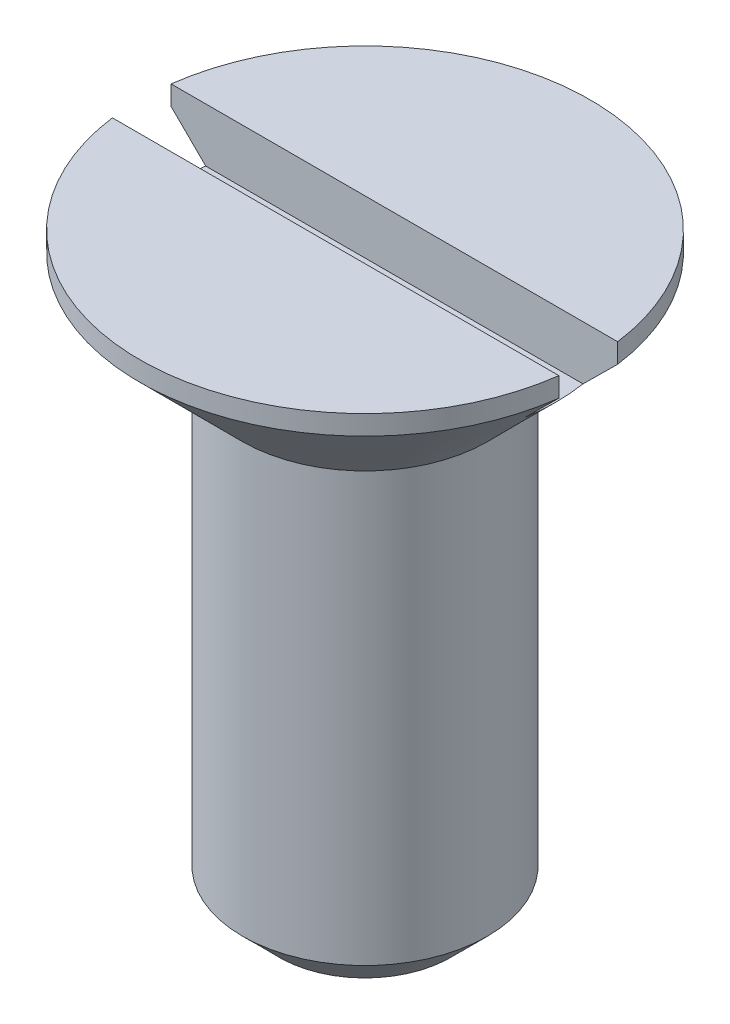
ISO-10303-21;
HEADER;
FILE_DESCRIPTION(('STEP AP214'),'2;1');
FILE_NAME('part.step','',(''),(''),'','','');
FILE_SCHEMA(('AUTOMOTIVE_DESIGN { 1 0 10303 214 1 1 1 1 }'));
ENDSEC;
DATA;
#1=APPLICATION_CONTEXT('core data for automotive mechanical design processes');
#2=APPLICATION_PROTOCOL_DEFINITION('international standard','automotive_design',2000,#1);
#3=PRODUCT_CONTEXT('',#1,'mechanical');
#4=PRODUCT('Part','Part','',(#3));
#5=PRODUCT_RELATED_PRODUCT_CATEGORY('part','',(#4));
#6=PRODUCT_DEFINITION_FORMATION('','',#4);
#7=PRODUCT_DEFINITION_CONTEXT('part definition',#1,'design');
#8=PRODUCT_DEFINITION('design','',#6,#7);
#9=PRODUCT_DEFINITION_SHAPE('','',#8);
#10=(LENGTH_UNIT() NAMED_UNIT(*) SI_UNIT(.MILLI.,.METRE.));
#11=(NAMED_UNIT(*) PLANE_ANGLE_UNIT() SI_UNIT($,.RADIAN.));
#12=(NAMED_UNIT(*) SI_UNIT($,.STERADIAN.) SOLID_ANGLE_UNIT());
#13=UNCERTAINTY_MEASURE_WITH_UNIT(LENGTH_MEASURE(1.E-05),#10,'distance_accuracy_value','');
#14=(GEOMETRIC_REPRESENTATION_CONTEXT(3) GLOBAL_UNCERTAINTY_ASSIGNED_CONTEXT((#13)) GLOBAL_UNIT_ASSIGNED_CONTEXT((#10,
#11,#12)) REPRESENTATION_CONTEXT('',''));
#15=CARTESIAN_POINT('',(0.,0.,0.));
#16=DIRECTION('',(0.,0.,1.));
#17=DIRECTION('',(1.,0.,0.));
#18=AXIS2_PLACEMENT_3D('',#15,#16,#17);
#19=CARTESIAN_POINT('',(0.,125.763182897862,0.));
#20=DIRECTION('',(0.,1.,0.));
#21=DIRECTION('',(-1.,0.,0.));
#22=AXIS2_PLACEMENT_3D('',#19,#20,#21);
#23=CYLINDRICAL_SURFACE('',#22,4.60000000000001);
#24=CARTESIAN_POINT('',(0.,91.6350422227854,0.));
#25=DIRECTION('',(0.,1.,0.));
#26=DIRECTION('',(-1.,0.,0.));
#27=AXIS2_PLACEMENT_3D('',#24,#25,#26);
#28=CIRCLE('',#27,4.60000000000001);
#29=CARTESIAN_POINT('',(4.56070170039656,91.6350422227854,-0.600000000000001));
#30=VERTEX_POINT('',#29);
#31=CARTESIAN_POINT('',(-4.56070170039657,91.6350422227854,-0.599999999999999));
#32=VERTEX_POINT('',#31);
#33=EDGE_CURVE('E103',#30,#32,#28,.T.);
#34=ORIENTED_EDGE('',*,*,#33,.T.);
#35=DIRECTION('',(0.,1.,0.));
#36=VECTOR('',#35,1.);
#37=CARTESIAN_POINT('',(-4.56070170039657,125.763182897862,-0.599999999999999));
#38=LINE('',#37,#36);
#39=CARTESIAN_POINT('',(-4.56070170039657,92.0350422227854,-0.599999999999999));
#40=VERTEX_POINT('',#39);
#41=EDGE_CURVE('E136',#32,#40,#38,.T.);
#42=ORIENTED_EDGE('',*,*,#41,.T.);
#43=CARTESIAN_POINT('',(0.,92.0350422227854,0.));
#44=DIRECTION('',(0.,1.,0.));
#45=DIRECTION('',(-1.,0.,0.));
#46=AXIS2_PLACEMENT_3D('',#43,#44,#45);
#47=CIRCLE('',#46,4.60000000000001);
#48=CARTESIAN_POINT('',(4.56070170039656,92.0350422227854,-0.600000000000001));
#49=VERTEX_POINT('',#48);
#50=EDGE_CURVE('E100',#49,#40,#47,.T.);
#51=ORIENTED_EDGE('',*,*,#50,.F.);
#52=DIRECTION('',(0.,1.,0.));
#53=VECTOR('',#52,1.);
#54=CARTESIAN_POINT('',(4.56070170039655,125.763182897862,-0.600000000000001));
#55=LINE('',#54,#53);
#56=EDGE_CURVE('E106',#49,#30,#55,.F.);
#57=ORIENTED_EDGE('',*,*,#56,.T.);
#58=EDGE_LOOP('',(#34,#42,#51,#57));
#59=FACE_BOUND('',#58,.T.);
#60=ADVANCED_FACE('F29',(#59),#23,.T.);
#61=CARTESIAN_POINT('',(0.,92.0350422227854,0.));
#62=DIRECTION('',(0.,-1.,0.));
#63=DIRECTION('',(1.,0.,0.));
#64=AXIS2_PLACEMENT_3D('',#61,#62,#63);
#65=PLANE('',#64);
#66=ORIENTED_EDGE('',*,*,#50,.T.);
#67=DIRECTION('',(1.,0.,0.));
#68=VECTOR('',#67,1.);
#69=CARTESIAN_POINT('',(0.,92.0350422227854,-0.6));
#70=LINE('',#69,#68);
#71=EDGE_CURVE('E88',#40,#49,#70,.T.);
#72=ORIENTED_EDGE('',*,*,#71,.T.);
#73=EDGE_LOOP('',(#66,#72));
#74=FACE_BOUND('',#73,.T.);
#75=ADVANCED_FACE('F162',(#74),#65,.F.);
#76=CARTESIAN_POINT('',(-4.56070170039657,91.6350422227854,0.600000000000001));
#77=VERTEX_POINT('',#76);
#78=CARTESIAN_POINT('',(4.56070170039656,91.6350422227854,0.599999999999999));
#79=VERTEX_POINT('',#78);
#80=EDGE_CURVE('E89',#77,#79,#28,.T.);
#81=ORIENTED_EDGE('',*,*,#80,.T.);
#82=DIRECTION('',(0.,1.,0.));
#83=VECTOR('',#82,1.);
#84=CARTESIAN_POINT('',(4.56070170039655,125.763182897862,0.599999999999999));
#85=LINE('',#84,#83);
#86=CARTESIAN_POINT('',(4.56070170039656,92.0350422227854,0.599999999999999));
#87=VERTEX_POINT('',#86);
#88=EDGE_CURVE('E83',#79,#87,#85,.T.);
#89=ORIENTED_EDGE('',*,*,#88,.T.);
#90=CARTESIAN_POINT('',(-4.56070170039657,92.0350422227854,0.600000000000001));
#91=VERTEX_POINT('',#90);
#92=EDGE_CURVE('E93',#91,#87,#47,.T.);
#93=ORIENTED_EDGE('',*,*,#92,.F.);
#94=DIRECTION('',(0.,1.,0.));
#95=VECTOR('',#94,1.);
#96=CARTESIAN_POINT('',(-4.56070170039657,125.763182897862,0.600000000000001));
#97=LINE('',#96,#95);
#98=EDGE_CURVE('E44',#91,#77,#97,.F.);
#99=ORIENTED_EDGE('',*,*,#98,.T.);
#100=EDGE_LOOP('',(#81,#89,#93,#99));
#101=FACE_BOUND('',#100,.T.);
#102=ADVANCED_FACE('F31',(#101),#23,.T.);
#103=CARTESIAN_POINT('',(0.,89.5350422227853,0.));
#104=DIRECTION('',(0.,1.,0.));
#105=DIRECTION('',(-1.,0.,0.));
#106=AXIS2_PLACEMENT_3D('',#103,#104,#105);
#107=CONICAL_SURFACE('',#106,2.50000000000001,0.785398163397447);
#108=ORIENTED_EDGE('',*,*,#33,.F.);
#109=CARTESIAN_POINT('',(10.1183814062174,97.1711974249163,-0.600000000000001));
#110=CARTESIAN_POINT('',(9.77237880412529,96.8258061906552,-0.600000000000001));
#111=CARTESIAN_POINT('',(9.42634955709616,96.4804416345571,-0.600000000000001));
#112=CARTESIAN_POINT('',(8.73419947980488,95.7897950444589,-0.600000000000001));
#113=CARTESIAN_POINT('',(8.388078648379,95.4445130116251,-0.600000000000001));
#114=CARTESIAN_POINT('',(7.69561256912969,94.7539663689884,-0.600000000000001));
#115=CARTESIAN_POINT('',(7.34926728513487,94.4087017954521,-0.600000000000001));
#116=CARTESIAN_POINT('',(6.65639767644153,93.7183613801069,-0.600000000000001));
#117=CARTESIAN_POINT('',(6.30987335413863,93.3732855358936,-0.600000000000001));
#118=CARTESIAN_POINT('',(5.60826287125325,92.6751948374246,-0.600000000000001));
#119=CARTESIAN_POINT('',(5.25316970822674,92.3221870172649,-0.600000000000001));
#120=CARTESIAN_POINT('',(4.7201088126015,91.7930850430478,-0.600000000000001));
#121=CARTESIAN_POINT('',(4.54234803292824,91.6167824265002,-0.600000000000001));
#122=CARTESIAN_POINT('',(4.18662953547047,91.2643774012031,-0.600000000000001));
#123=CARTESIAN_POINT('',(4.00867181849118,91.0882749916411,-0.6));
#124=CARTESIAN_POINT('',(3.65250227610172,90.7363944531224,-0.6));
#125=CARTESIAN_POINT('',(3.47429050503804,90.5606162691968,-0.6));
#126=CARTESIAN_POINT('',(3.11741605694824,90.2095126089977,-0.6));
#127=CARTESIAN_POINT('',(2.93875337293158,90.034187139829,-0.6));
#128=CARTESIAN_POINT('',(2.58070617190924,89.6842982894952,-0.6));
#129=CARTESIAN_POINT('',(2.40132170753326,89.5097348546333,-0.6));
#130=CARTESIAN_POINT('',(2.13120273030564,89.2489731972991,-0.6));
#131=CARTESIAN_POINT('',(2.04099050490045,89.1622343171125,-0.6));
#132=CARTESIAN_POINT('',(1.86005552948669,88.989291070384,-0.6));
#133=CARTESIAN_POINT('',(1.76933278423143,88.9030866988811,-0.6));
#134=CARTESIAN_POINT('',(1.62900147259109,88.7709497673453,-0.6));
#135=CARTESIAN_POINT('',(1.57966840408975,88.7247248039743,-0.6));
#136=CARTESIAN_POINT('',(1.48070610854209,88.6325913272551,-0.6));
#137=CARTESIAN_POINT('',(1.4310768773385,88.5866828183688,-0.6));
#138=CARTESIAN_POINT('',(1.33153228050089,88.4953792770954,-0.6));
#139=CARTESIAN_POINT('',(1.28161769843002,88.4499833927485,-0.6));
#140=CARTESIAN_POINT('',(1.18126809147799,88.3597737364228,-0.6));
#141=CARTESIAN_POINT('',(1.13083308164358,88.3149599476984,-0.6));
#142=CARTESIAN_POINT('',(1.01594428142606,88.2145154966473,-0.6));
#143=CARTESIAN_POINT('',(0.951277890986286,88.1591252346927,-0.6));
#144=CARTESIAN_POINT('',(0.852790765066545,88.0775958456865,-0.6));
#145=CARTESIAN_POINT('',(0.81965389261971,88.0506324331999,-0.6));
#146=CARTESIAN_POINT('',(0.752777223477808,87.9974660707094,-0.6));
#147=CARTESIAN_POINT('',(0.719037476243006,87.9712630587804,-0.6));
#148=CARTESIAN_POINT('',(0.65048142845816,87.9196953491401,-0.6));
#149=CARTESIAN_POINT('',(0.615658548989345,87.8943393357401,-0.6));
#150=CARTESIAN_POINT('',(0.544903946043137,87.8451477875962,-0.6));
#151=CARTESIAN_POINT('',(0.508971381999003,87.8213134495998,-0.6));
#152=CARTESIAN_POINT('',(0.43578405330071,87.7760439984933,-0.6));
#153=CARTESIAN_POINT('',(0.398534766710509,87.7546002032245,-0.6));
#154=CARTESIAN_POINT('',(0.322227819580053,87.715305202778,-0.6));
#155=CARTESIAN_POINT('',(0.283173497154299,87.6974476685799,-0.6));
#156=CARTESIAN_POINT('',(0.202020652551026,87.6670144522289,-0.6));
#157=CARTESIAN_POINT('',(0.159877310376875,87.6545497761668,-0.6));
#158=CARTESIAN_POINT('',(0.0955758352340131,87.6422428328775,-0.6));
#159=CARTESIAN_POINT('',(0.0740249717194329,87.6392051798506,-0.6));
#160=CARTESIAN_POINT('',(0.0307182768822359,87.6354419032215,-0.6));
#161=CARTESIAN_POINT('',(0.00896247682933661,87.6347159324499,-0.6));
#162=CARTESIAN_POINT('',(-0.0345699639383349,87.6356417056636,-0.6));
#163=CARTESIAN_POINT('',(-0.0563464310543447,87.6373014090222,-0.6));
#164=CARTESIAN_POINT('',(-0.0996152185496461,87.6428756091461,-0.6));
#165=CARTESIAN_POINT('',(-0.121107336978696,87.646791628788,-0.6));
#166=CARTESIAN_POINT('',(-0.185134942209239,87.6615779230767,-0.6));
#167=CARTESIAN_POINT('',(-0.226969791715522,87.6754759618972,-0.6));
#168=CARTESIAN_POINT('',(-0.315586324599734,87.7115427172652,-0.6));
#169=CARTESIAN_POINT('',(-0.361919520428995,87.7347444443576,-0.6));
#170=CARTESIAN_POINT('',(-0.452224755648142,87.7854541151573,-0.6));
#171=CARTESIAN_POINT('',(-0.496190701048888,87.8129725200949,-0.6));
#172=CARTESIAN_POINT('',(-0.582670192201253,87.8707850073226,-0.6));
#173=CARTESIAN_POINT('',(-0.625171506044438,87.9010970676717,-0.6));
#174=CARTESIAN_POINT('',(-0.708877631350628,87.963336031104,-0.6));
#175=CARTESIAN_POINT('',(-0.750084003850097,87.9952608585858,-0.6));
#176=CARTESIAN_POINT('',(-0.837865316854145,88.0651925186186,-0.6));
#177=CARTESIAN_POINT('',(-0.884294486800732,88.1033812639536,-0.6));
#178=CARTESIAN_POINT('',(-0.976334289151162,88.180735575695,-0.6));
#179=CARTESIAN_POINT('',(-1.02194484154761,88.2199012366957,-0.6));
#180=CARTESIAN_POINT('',(-1.15793123332394,88.3384233163224,-0.6));
#181=CARTESIAN_POINT('',(-1.2474322930666,88.4187805994875,-0.6));
#182=CARTESIAN_POINT('',(-1.4252515599586,88.5810203963855,-0.6));
#183=CARTESIAN_POINT('',(-1.51356798693599,88.6629048412524,-0.6));
#184=CARTESIAN_POINT('',(-1.68936713658788,88.8275294992386,-0.6));
#185=CARTESIAN_POINT('',(-1.77685001626741,88.9102695448215,-0.6));
#186=CARTESIAN_POINT('',(-1.95074219272013,89.075800548441,-0.6));
#187=CARTESIAN_POINT('',(-2.03715478318169,89.1585880553625,-0.6));
#188=CARTESIAN_POINT('',(-2.20961469118055,89.3245509976718,-0.6));
#189=CARTESIAN_POINT('',(-2.29566199027879,89.4077264522077,-0.6));
#190=CARTESIAN_POINT('',(-2.55328247225683,89.6575365067473,-0.6));
#191=CARTESIAN_POINT('',(-2.72446181119681,89.8245769488416,-0.6));
#192=CARTESIAN_POINT('',(-3.19700560903381,90.2872827869049,-0.6));
#193=CARTESIAN_POINT('',(-3.49776123544563,90.5835688070181,-0.6));
#194=CARTESIAN_POINT('',(-4.09847548130347,91.1769520537994,-0.6));
#195=CARTESIAN_POINT('',(-4.39843409280127,91.4740492884979,-0.599999999999999));
#196=CARTESIAN_POINT('',(-4.99800686759835,92.0687909715099,-0.599999999999999));
#197=CARTESIAN_POINT('',(-5.2976208825954,92.3664355693181,-0.599999999999999));
#198=CARTESIAN_POINT('',(-5.89658396088355,92.9619889882596,-0.599999999999999));
#199=CARTESIAN_POINT('',(-6.19593302510774,93.259897808455,-0.599999999999999));
#200=CARTESIAN_POINT('',(-6.79741034406435,93.858825334728,-0.599999999999999));
#201=CARTESIAN_POINT('',(-7.09953690219863,94.1598457445183,-0.599999999999999));
#202=CARTESIAN_POINT('',(-7.70367180435057,94.7620058689572,-0.599999999999999));
#203=CARTESIAN_POINT('',(-8.00568014822725,95.0631455837474,-0.599999999999999));
#204=CARTESIAN_POINT('',(-8.6095058889519,95.6654023879578,-0.599999999999999));
#205=CARTESIAN_POINT('',(-8.91132331553827,95.966519447564,-0.599999999999999));
#206=CARTESIAN_POINT('',(-9.51489468647575,96.5688164140502,-0.599999999999999));
#207=CARTESIAN_POINT('',(-9.81664863090741,96.8699963208495,-0.599999999999999));
#208=CARTESIAN_POINT('',(-10.1183814062174,97.1711974249163,-0.599999999999999));
#209=B_SPLINE_CURVE_WITH_KNOTS('',3,(#109,#110,#111,#112,#113,#114,#115,#116,#117,#118,#119,
#120,#121,#122,#123,#124,#125,#126,#127,#128,#129,#130,#131,#132,#133,#134,#135,#136,#137,#138,
#139,#140,#141,#142,#143,#144,#145,#146,#147,#148,#149,#150,#151,#152,#153,#154,#155,#156,#157,
#158,#159,#160,#161,#162,#163,#164,#165,#166,#167,#168,#169,#170,#171,#172,#173,#174,#175,#176,
#177,#178,#179,#180,#181,#182,#183,#184,#185,#186,#187,#188,#189,#190,#191,#192,#193,#194,#195,
#196,#197,#198,#199,#200,#201,#202,#203,#204,#205,#206,#207,#208),.UNSPECIFIED.,.F.,.F.,(4,2,2,
2,2,2,2,2,2,2,2,2,2,2,2,2,2,2,2,2,2,2,2,2,2,2,2,2,2,2,2,2,2,2,2,2,2,2,2,2,2,2,2,2,2,2,2,2,2,4),
(0.,1.46666839645602,2.93335642204375,4.40048422144732,5.86759287368602,7.36970800027689,
8.12079614107719,8.87188122211631,9.62282443414831,10.3737793604997,11.1246804877892,
11.5001215583743,11.8755591390815,12.078374479308,12.2811926731976,12.4835998979482,
12.68600128695,12.9414034371595,13.0695584519762,13.1977030007061,13.3269032063192,
13.4562038027618,13.5850183434979,13.7136035154947,13.8447223153937,13.909904833434,
13.9750775618726,14.0404682327611,14.1059030901693,14.2375157523496,14.3926020902522,
14.5480702492761,14.7046199715825,14.8609731099616,15.0413034803932,15.2216513804381,
15.5824616874418,15.9437642015595,16.3049972599939,16.6640058405436,17.0230323325191,
17.7405554623534,19.0071037148547,20.2736645509393,21.5406479401796,22.8076268494675,
24.0870968810828,25.3665684340811,26.6455864777223,27.92460288811),.UNSPECIFIED.);
#210=CARTESIAN_POINT('',(3.85356977359954,90.9350422227854,-0.6));
#211=VERTEX_POINT('',#210);
#212=EDGE_CURVE('E52',#30,#211,#209,.T.);
#213=ORIENTED_EDGE('',*,*,#212,.T.);
#214=CARTESIAN_POINT('',(0.,90.9350422227854,0.));
#215=DIRECTION('',(0.,1.,0.));
#216=DIRECTION('',(0.,0.,1.));
#217=AXIS2_PLACEMENT_3D('',#214,#215,#216);
#218=CIRCLE('',#217,3.90000000000001);
#219=CARTESIAN_POINT('',(3.85356977359954,90.9350422227854,0.6));
#220=VERTEX_POINT('',#219);
#221=EDGE_CURVE('E115',#220,#211,#218,.T.);
#222=ORIENTED_EDGE('',*,*,#221,.F.);
#223=CARTESIAN_POINT('',(-10.1183814062174,97.1711974249163,0.600000000000001));
#224=CARTESIAN_POINT('',(-9.7723788041253,96.8258061906552,0.600000000000001));
#225=CARTESIAN_POINT('',(-9.42634955709618,96.4804416345571,0.600000000000001));
#226=CARTESIAN_POINT('',(-8.73419947980489,95.7897950444589,0.600000000000001));
#227=CARTESIAN_POINT('',(-8.38807864837902,95.4445130116251,0.600000000000001));
#228=CARTESIAN_POINT('',(-7.6956125691297,94.7539663689884,0.600000000000001));
#229=CARTESIAN_POINT('',(-7.34926728513488,94.4087017954521,0.600000000000001));
#230=CARTESIAN_POINT('',(-6.65639767644154,93.7183613801069,0.600000000000001));
#231=CARTESIAN_POINT('',(-6.30987335413864,93.3732855358936,0.600000000000001));
#232=CARTESIAN_POINT('',(-5.60826287125327,92.6751948374246,0.600000000000001));
#233=CARTESIAN_POINT('',(-5.25316970822675,92.3221870172649,0.600000000000001));
#234=CARTESIAN_POINT('',(-4.72010881260151,91.7930850430478,0.600000000000001));
#235=CARTESIAN_POINT('',(-4.54234803292826,91.6167824265002,0.600000000000001));
#236=CARTESIAN_POINT('',(-4.18662953547049,91.2643774012031,0.600000000000001));
#237=CARTESIAN_POINT('',(-4.0086718184912,91.0882749916411,0.6));
#238=CARTESIAN_POINT('',(-3.65250227610173,90.7363944531224,0.6));
#239=CARTESIAN_POINT('',(-3.47429050503805,90.5606162691968,0.6));
#240=CARTESIAN_POINT('',(-3.11741605694825,90.2095126089977,0.6));
#241=CARTESIAN_POINT('',(-2.93875337293159,90.034187139829,0.6));
#242=CARTESIAN_POINT('',(-2.58070617190925,89.6842982894952,0.6));
#243=CARTESIAN_POINT('',(-2.40132170753328,89.5097348546333,0.6));
#244=CARTESIAN_POINT('',(-2.13120273030565,89.2489731972991,0.6));
#245=CARTESIAN_POINT('',(-2.04099050490047,89.1622343171125,0.6));
#246=CARTESIAN_POINT('',(-1.8600555294867,88.989291070384,0.6));
#247=CARTESIAN_POINT('',(-1.76933278423144,88.9030866988811,0.6));
#248=CARTESIAN_POINT('',(-1.6290014725911,88.7709497673453,0.6));
#249=CARTESIAN_POINT('',(-1.57966840408976,88.7247248039743,0.6));
#250=CARTESIAN_POINT('',(-1.4807061085421,88.6325913272551,0.6));
#251=CARTESIAN_POINT('',(-1.43107687733852,88.5866828183688,0.6));
#252=CARTESIAN_POINT('',(-1.3315322805009,88.4953792770954,0.6));
#253=CARTESIAN_POINT('',(-1.28161769843003,88.4499833927485,0.6));
#254=CARTESIAN_POINT('',(-1.181268091478,88.3597737364228,0.6));
#255=CARTESIAN_POINT('',(-1.13083308164359,88.3149599476984,0.6));
#256=CARTESIAN_POINT('',(-1.01594428142607,88.2145154966473,0.6));
#257=CARTESIAN_POINT('',(-0.951277890986299,88.1591252346927,0.6));
#258=CARTESIAN_POINT('',(-0.852790765066558,88.0775958456865,0.6));
#259=CARTESIAN_POINT('',(-0.819653892619723,88.0506324331999,0.6));
#260=CARTESIAN_POINT('',(-0.752777223477821,87.9974660707094,0.6));
#261=CARTESIAN_POINT('',(-0.719037476243018,87.9712630587804,0.6));
#262=CARTESIAN_POINT('',(-0.650481428458174,87.9196953491401,0.6));
#263=CARTESIAN_POINT('',(-0.615658548989362,87.8943393357401,0.6));
#264=CARTESIAN_POINT('',(-0.544903946043154,87.8451477875962,0.6));
#265=CARTESIAN_POINT('',(-0.508971381999019,87.8213134495998,0.6));
#266=CARTESIAN_POINT('',(-0.435784053300724,87.7760439984933,0.6));
#267=CARTESIAN_POINT('',(-0.398534766710523,87.7546002032245,0.6));
#268=CARTESIAN_POINT('',(-0.322227819580067,87.715305202778,0.6));
#269=CARTESIAN_POINT('',(-0.283173497154314,87.6974476685799,0.6));
#270=CARTESIAN_POINT('',(-0.20202065255104,87.6670144522289,0.6));
#271=CARTESIAN_POINT('',(-0.159877310376889,87.6545497761668,0.6));
#272=CARTESIAN_POINT('',(-0.0955758352340269,87.6422428328775,0.6));
#273=CARTESIAN_POINT('',(-0.0740249717194477,87.6392051798506,0.6));
#274=CARTESIAN_POINT('',(-0.0307182768822508,87.6354419032215,0.6));
#275=CARTESIAN_POINT('',(-0.00896247682935049,87.6347159324499,0.6));
#276=CARTESIAN_POINT('',(0.034569963938322,87.6356417056636,0.6));
#277=CARTESIAN_POINT('',(0.0563464310543318,87.6373014090222,0.6));
#278=CARTESIAN_POINT('',(0.0996152185496332,87.6428756091461,0.6));
#279=CARTESIAN_POINT('',(0.121107336978684,87.646791628788,0.6));
#280=CARTESIAN_POINT('',(0.185134942209226,87.6615779230767,0.6));
#281=CARTESIAN_POINT('',(0.226969791715509,87.6754759618972,0.6));
#282=CARTESIAN_POINT('',(0.315586324599722,87.7115427172652,0.6));
#283=CARTESIAN_POINT('',(0.361919520428982,87.7347444443576,0.6));
#284=CARTESIAN_POINT('',(0.452224755648129,87.7854541151573,0.6));
#285=CARTESIAN_POINT('',(0.496190701048876,87.8129725200949,0.6));
#286=CARTESIAN_POINT('',(0.58267019220124,87.8707850073226,0.6));
#287=CARTESIAN_POINT('',(0.625171506044425,87.9010970676717,0.6));
#288=CARTESIAN_POINT('',(0.708877631350615,87.963336031104,0.6));
#289=CARTESIAN_POINT('',(0.750084003850083,87.9952608585858,0.6));
#290=CARTESIAN_POINT('',(0.837865316854127,88.0651925186186,0.6));
#291=CARTESIAN_POINT('',(0.88429448680071,88.1033812639536,0.6));
#292=CARTESIAN_POINT('',(0.976334289151141,88.180735575695,0.6));
#293=CARTESIAN_POINT('',(1.02194484154759,88.2199012366957,0.6));
#294=CARTESIAN_POINT('',(1.15793123332392,88.3384233163224,0.6));
#295=CARTESIAN_POINT('',(1.24743229306659,88.4187805994875,0.6));
#296=CARTESIAN_POINT('',(1.42525155995859,88.5810203963855,0.6));
#297=CARTESIAN_POINT('',(1.51356798693597,88.6629048412524,0.6));
#298=CARTESIAN_POINT('',(1.68936713658787,88.8275294992386,0.6));
#299=CARTESIAN_POINT('',(1.77685001626739,88.9102695448215,0.6));
#300=CARTESIAN_POINT('',(1.95074219272012,89.075800548441,0.6));
#301=CARTESIAN_POINT('',(2.03715478318168,89.1585880553625,0.6));
#302=CARTESIAN_POINT('',(2.20961469118053,89.3245509976718,0.6));
#303=CARTESIAN_POINT('',(2.29566199027877,89.4077264522077,0.6));
#304=CARTESIAN_POINT('',(2.55328247225681,89.6575365067473,0.6));
#305=CARTESIAN_POINT('',(2.7244618111968,89.8245769488416,0.6));
#306=CARTESIAN_POINT('',(3.19700560903379,90.2872827869049,0.6));
#307=CARTESIAN_POINT('',(3.49776123544562,90.5835688070181,0.6));
#308=CARTESIAN_POINT('',(4.09847548130346,91.1769520537994,0.6));
#309=CARTESIAN_POINT('',(4.39843409280125,91.4740492884979,0.599999999999999));
#310=CARTESIAN_POINT('',(4.99800686759834,92.0687909715099,0.599999999999999));
#311=CARTESIAN_POINT('',(5.29762088259539,92.3664355693181,0.599999999999999));
#312=CARTESIAN_POINT('',(5.89658396088353,92.9619889882596,0.599999999999999));
#313=CARTESIAN_POINT('',(6.19593302510772,93.259897808455,0.599999999999999));
#314=CARTESIAN_POINT('',(6.79741034406433,93.858825334728,0.599999999999999));
#315=CARTESIAN_POINT('',(7.09953690219861,94.1598457445183,0.599999999999999));
#316=CARTESIAN_POINT('',(7.70367180435056,94.7620058689572,0.599999999999999));
#317=CARTESIAN_POINT('',(8.00568014822723,95.0631455837474,0.599999999999999));
#318=CARTESIAN_POINT('',(8.60950588895188,95.6654023879578,0.599999999999999));
#319=CARTESIAN_POINT('',(8.91132331553826,95.966519447564,0.599999999999999));
#320=CARTESIAN_POINT('',(9.51489468647573,96.5688164140502,0.599999999999999));
#321=CARTESIAN_POINT('',(9.8166486309074,96.8699963208495,0.599999999999999));
#322=CARTESIAN_POINT('',(10.1183814062173,97.1711974249163,0.599999999999999));
#323=B_SPLINE_CURVE_WITH_KNOTS('',3,(#223,#224,#225,#226,#227,#228,#229,#230,#231,#232,#233,
#234,#235,#236,#237,#238,#239,#240,#241,#242,#243,#244,#245,#246,#247,#248,#249,#250,#251,#252,
#253,#254,#255,#256,#257,#258,#259,#260,#261,#262,#263,#264,#265,#266,#267,#268,#269,#270,#271,
#272,#273,#274,#275,#276,#277,#278,#279,#280,#281,#282,#283,#284,#285,#286,#287,#288,#289,#290,
#291,#292,#293,#294,#295,#296,#297,#298,#299,#300,#301,#302,#303,#304,#305,#306,#307,#308,#309,
#310,#311,#312,#313,#314,#315,#316,#317,#318,#319,#320,#321,#322),.UNSPECIFIED.,.F.,.F.,(4,2,2,
2,2,2,2,2,2,2,2,2,2,2,2,2,2,2,2,2,2,2,2,2,2,2,2,2,2,2,2,2,2,2,2,2,2,2,2,2,2,2,2,2,2,2,2,2,2,4),
(0.,1.46666839645601,2.93335642204375,4.40048422144732,5.86759287368602,7.36970800027689,
8.12079614107719,8.87188122211631,9.62282443414831,10.3737793604997,11.1246804877892,
11.5001215583743,11.8755591390815,12.078374479308,12.2811926731976,12.4835998979482,
12.68600128695,12.9414034371596,13.0695584519762,13.1977030007061,13.3269032063192,
13.4562038027618,13.5850183434979,13.7136035154947,13.8447223153937,13.909904833434,
13.9750775618726,14.0404682327611,14.1059030901693,14.2375157523496,14.3926020902522,
14.5480702492761,14.7046199715825,14.8609731099616,15.0413034803931,15.2216513804381,
15.5824616874418,15.9437642015595,16.3049972599939,16.6640058405436,17.0230323325191,
17.7405554623534,19.0071037148547,20.2736645509393,21.5406479401796,22.8076268494675,
24.0870968810828,25.3665684340811,26.6455864777223,27.92460288811),.UNSPECIFIED.);
#324=EDGE_CURVE('E96',#220,#79,#323,.T.);
#325=ORIENTED_EDGE('',*,*,#324,.T.);
#326=ORIENTED_EDGE('',*,*,#80,.F.);
#327=CARTESIAN_POINT('',(-3.85356977359955,90.9350422227854,0.6));
#328=VERTEX_POINT('',#327);
#329=EDGE_CURVE('E95',#77,#328,#323,.T.);
#330=ORIENTED_EDGE('',*,*,#329,.T.);
#331=CARTESIAN_POINT('',(-3.85356977359955,90.9350422227854,-0.6));
#332=VERTEX_POINT('',#331);
#333=EDGE_CURVE('E114',#332,#328,#218,.T.);
#334=ORIENTED_EDGE('',*,*,#333,.F.);
#335=EDGE_CURVE('E131',#332,#32,#209,.T.);
#336=ORIENTED_EDGE('',*,*,#335,.T.);
#337=EDGE_LOOP('',(#108,#213,#222,#325,#326,#330,#334,#336));
#338=FACE_BOUND('',#337,.T.);
#339=CARTESIAN_POINT('',(0.,89.5350422227853,0.));
#340=DIRECTION('',(0.,1.,0.));
#341=DIRECTION('',(-1.,0.,0.));
#342=AXIS2_PLACEMENT_3D('',#339,#340,#341);
#343=CIRCLE('',#342,2.50000000000001);
#344=CARTESIAN_POINT('',(-2.50000000000002,89.5350422227853,0.));
#345=VERTEX_POINT('',#344);
#346=EDGE_CURVE('E99',#345,#345,#343,.T.);
#347=ORIENTED_EDGE('',*,*,#346,.T.);
#348=EDGE_LOOP('',(#347));
#349=FACE_BOUND('',#348,.T.);
#350=ADVANCED_FACE('F134',(#338,#349),#107,.T.);
#351=CARTESIAN_POINT('',(0.,125.763182897862,0.));
#352=DIRECTION('',(0.,1.,0.));
#353=DIRECTION('',(-1.,0.,0.));
#354=AXIS2_PLACEMENT_3D('',#351,#352,#353);
#355=CYLINDRICAL_SURFACE('',#354,2.50000000000001);
#356=CARTESIAN_POINT('',(0.,80.7850422227854,0.));
#357=DIRECTION('',(0.,1.,0.));
#358=DIRECTION('',(-1.,0.,0.));
#359=AXIS2_PLACEMENT_3D('',#356,#357,#358);
#360=CIRCLE('',#359,2.50000000000001);
#361=CARTESIAN_POINT('',(-2.50000000000002,80.7850422227854,0.));
#362=VERTEX_POINT('',#361);
#363=EDGE_CURVE('E37',#362,#362,#360,.T.);
#364=ORIENTED_EDGE('',*,*,#363,.T.);
#365=EDGE_LOOP('',(#364));
#366=FACE_BOUND('',#365,.T.);
#367=ORIENTED_EDGE('',*,*,#346,.F.);
#368=EDGE_LOOP('',(#367));
#369=FACE_BOUND('',#368,.T.);
#370=ADVANCED_FACE('F164',(#366,#369),#355,.T.);
#371=CARTESIAN_POINT('',(2.50000000000001,80.0350422227854,0.));
#372=DIRECTION('',(0.,1.,0.));
#373=DIRECTION('',(-1.,0.,0.));
#374=AXIS2_PLACEMENT_3D('',#371,#372,#373);
#375=PLANE('',#374);
#376=CARTESIAN_POINT('',(0.,80.0350422227854,0.));
#377=DIRECTION('',(0.,1.,0.));
#378=DIRECTION('',(-1.,0.,0.));
#379=AXIS2_PLACEMENT_3D('',#376,#377,#378);
#380=CIRCLE('',#379,1.75000000000001);
#381=CARTESIAN_POINT('',(-1.75000000000002,80.0350422227854,0.));
#382=VERTEX_POINT('',#381);
#383=EDGE_CURVE('E11',#382,#382,#380,.F.);
#384=ORIENTED_EDGE('',*,*,#383,.T.);
#385=EDGE_LOOP('',(#384));
#386=FACE_BOUND('',#385,.T.);
#387=ADVANCED_FACE('F161',(#386),#375,.F.);
#388=ORIENTED_EDGE('',*,*,#92,.T.);
#389=DIRECTION('',(-1.,0.,0.));
#390=VECTOR('',#389,1.);
#391=CARTESIAN_POINT('',(0.,92.0350422227854,0.6));
#392=LINE('',#391,#390);
#393=EDGE_CURVE('E80',#87,#91,#392,.T.);
#394=ORIENTED_EDGE('',*,*,#393,.T.);
#395=EDGE_LOOP('',(#388,#394));
#396=FACE_BOUND('',#395,.T.);
#397=ADVANCED_FACE('F98',(#396),#65,.F.);
#398=CARTESIAN_POINT('',(-4.60000000000001,90.9350422227854,0.600000000000001));
#399=DIRECTION('',(0.,1.,0.));
#400=DIRECTION('',(0.,0.,1.));
#401=AXIS2_PLACEMENT_3D('',#398,#399,#400);
#402=PLANE('',#401);
#403=ORIENTED_EDGE('',*,*,#221,.T.);
#404=DIRECTION('',(-1.,0.,0.));
#405=VECTOR('',#404,1.);
#406=CARTESIAN_POINT('',(-4.60000000000001,90.9350422227854,-0.599999999999999));
#407=LINE('',#406,#405);
#408=EDGE_CURVE('E124',#211,#332,#407,.T.);
#409=ORIENTED_EDGE('',*,*,#408,.T.);
#410=ORIENTED_EDGE('',*,*,#333,.T.);
#411=DIRECTION('',(1.,0.,0.));
#412=VECTOR('',#411,1.);
#413=CARTESIAN_POINT('',(-4.60000000000001,90.9350422227854,0.600000000000001));
#414=LINE('',#413,#412);
#415=EDGE_CURVE('E127',#328,#220,#414,.T.);
#416=ORIENTED_EDGE('',*,*,#415,.T.);
#417=EDGE_LOOP('',(#403,#409,#410,#416));
#418=FACE_BOUND('',#417,.T.);
#419=ADVANCED_FACE('F123',(#418),#402,.T.);
#420=CARTESIAN_POINT('',(-4.60000000000001,90.9350422227854,-0.599999999999999));
#421=DIRECTION('',(0.,0.,-1.));
#422=DIRECTION('',(-1.,0.,0.));
#423=AXIS2_PLACEMENT_3D('',#420,#421,#422);
#424=PLANE('',#423);
#425=ORIENTED_EDGE('',*,*,#71,.F.);
#426=ORIENTED_EDGE('',*,*,#41,.F.);
#427=ORIENTED_EDGE('',*,*,#335,.F.);
#428=ORIENTED_EDGE('',*,*,#408,.F.);
#429=ORIENTED_EDGE('',*,*,#212,.F.);
#430=ORIENTED_EDGE('',*,*,#56,.F.);
#431=EDGE_LOOP('',(#425,#426,#427,#428,#429,#430));
#432=FACE_BOUND('',#431,.T.);
#433=ADVANCED_FACE('F129',(#432),#424,.F.);
#434=CARTESIAN_POINT('',(-4.60000000000001,90.9350422227854,0.600000000000001));
#435=DIRECTION('',(0.,0.,1.));
#436=DIRECTION('',(1.,0.,0.));
#437=AXIS2_PLACEMENT_3D('',#434,#435,#436);
#438=PLANE('',#437);
#439=ORIENTED_EDGE('',*,*,#393,.F.);
#440=ORIENTED_EDGE('',*,*,#88,.F.);
#441=ORIENTED_EDGE('',*,*,#324,.F.);
#442=ORIENTED_EDGE('',*,*,#415,.F.);
#443=ORIENTED_EDGE('',*,*,#329,.F.);
#444=ORIENTED_EDGE('',*,*,#98,.F.);
#445=EDGE_LOOP('',(#439,#440,#441,#442,#443,#444));
#446=FACE_BOUND('',#445,.T.);
#447=ADVANCED_FACE('F82',(#446),#438,.F.);
#448=CARTESIAN_POINT('',(0.,80.7850422227854,0.));
#449=DIRECTION('',(0.,1.,0.));
#450=DIRECTION('',(-1.,0.,0.));
#451=AXIS2_PLACEMENT_3D('',#448,#449,#450);
#452=CONICAL_SURFACE('',#451,2.50000000000001,0.785398163397449);
#453=ORIENTED_EDGE('',*,*,#383,.F.);
#454=EDGE_LOOP('',(#453));
#455=FACE_BOUND('',#454,.T.);
#456=ORIENTED_EDGE('',*,*,#363,.F.);
#457=EDGE_LOOP('',(#456));
#458=FACE_BOUND('',#457,.T.);
#459=ADVANCED_FACE('F156',(#455,#458),#452,.T.);
#460=CLOSED_SHELL('',(#60,#75,#102,#350,#370,#387,#397,#419,#433,#447,#459));
#461=MANIFOLD_SOLID_BREP('B2',#460);
#462=ADVANCED_BREP_SHAPE_REPRESENTATION('',(#18,#461),#14);
#463=SHAPE_DEFINITION_REPRESENTATION(#9,#462);
ENDSEC;
END-ISO-10303-21;
